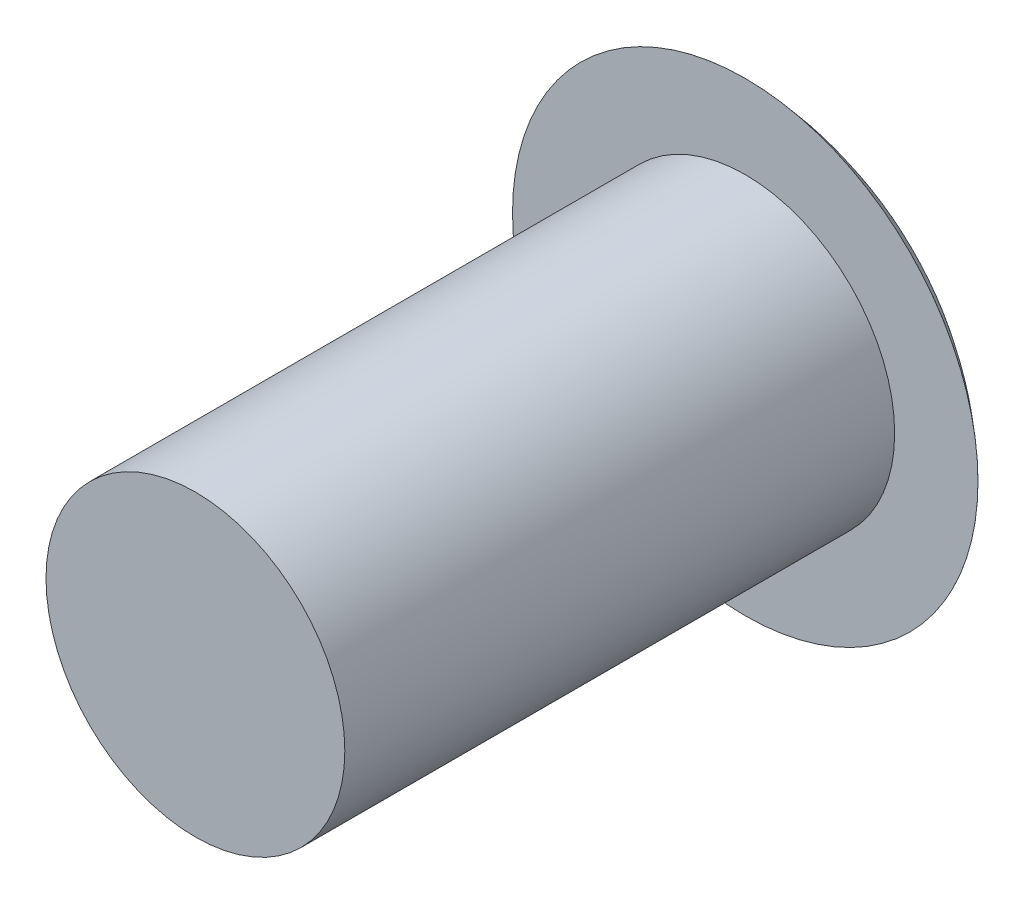
ISO-10303-21;
HEADER;
FILE_DESCRIPTION(('STEP AP214'),'2;1');
FILE_NAME('part.step','',(''),(''),'','','');
FILE_SCHEMA(('AUTOMOTIVE_DESIGN { 1 0 10303 214 1 1 1 1 }'));
ENDSEC;
DATA;
#1=APPLICATION_CONTEXT('core data for automotive mechanical design processes');
#2=APPLICATION_PROTOCOL_DEFINITION('international standard','automotive_design',2000,#1);
#3=PRODUCT_CONTEXT('',#1,'mechanical');
#4=PRODUCT('Part','Part','',(#3));
#5=PRODUCT_RELATED_PRODUCT_CATEGORY('part','',(#4));
#6=PRODUCT_DEFINITION_FORMATION('','',#4);
#7=PRODUCT_DEFINITION_CONTEXT('part definition',#1,'design');
#8=PRODUCT_DEFINITION('design','',#6,#7);
#9=PRODUCT_DEFINITION_SHAPE('','',#8);
#10=(LENGTH_UNIT() NAMED_UNIT(*) SI_UNIT(.MILLI.,.METRE.));
#11=(NAMED_UNIT(*) PLANE_ANGLE_UNIT() SI_UNIT($,.RADIAN.));
#12=(NAMED_UNIT(*) SI_UNIT($,.STERADIAN.) SOLID_ANGLE_UNIT());
#13=UNCERTAINTY_MEASURE_WITH_UNIT(LENGTH_MEASURE(1.E-05),#10,'distance_accuracy_value','');
#14=(GEOMETRIC_REPRESENTATION_CONTEXT(3) GLOBAL_UNCERTAINTY_ASSIGNED_CONTEXT((#13)) GLOBAL_UNIT_ASSIGNED_CONTEXT((#10,
#11,#12)) REPRESENTATION_CONTEXT('',''));
#15=CARTESIAN_POINT('',(0.,0.,0.));
#16=DIRECTION('',(0.,0.,1.));
#17=DIRECTION('',(1.,0.,0.));
#18=AXIS2_PLACEMENT_3D('',#15,#16,#17);
#19=CARTESIAN_POINT('',(0.,0.,29.4163449570512));
#20=DIRECTION('',(0.,0.,-1.));
#21=DIRECTION('',(-1.,0.,0.));
#22=AXIS2_PLACEMENT_3D('',#19,#20,#21);
#23=CYLINDRICAL_SURFACE('',#22,14.49675);
#24=CARTESIAN_POINT('',(0.,0.,29.4163449570512));
#25=DIRECTION('',(0.,0.,1.));
#26=DIRECTION('',(1.,0.,0.));
#27=AXIS2_PLACEMENT_3D('',#24,#25,#26);
#28=CIRCLE('',#27,14.49675);
#29=CARTESIAN_POINT('',(14.49675,0.,29.4163449570512));
#30=VERTEX_POINT('',#29);
#31=EDGE_CURVE('E157',#30,#30,#28,.T.);
#32=ORIENTED_EDGE('',*,*,#31,.F.);
#33=EDGE_LOOP('',(#32));
#34=FACE_BOUND('',#33,.T.);
#35=CARTESIAN_POINT('',(0.,0.,-23.9316950429488));
#36=DIRECTION('',(0.,0.,1.));
#37=DIRECTION('',(1.,0.,0.));
#38=AXIS2_PLACEMENT_3D('',#35,#36,#37);
#39=CIRCLE('',#38,14.49675);
#40=CARTESIAN_POINT('',(14.49675,0.,-23.9316950429488));
#41=VERTEX_POINT('',#40);
#42=EDGE_CURVE('E161',#41,#41,#39,.T.);
#43=ORIENTED_EDGE('',*,*,#42,.T.);
#44=EDGE_LOOP('',(#43));
#45=FACE_BOUND('',#44,.T.);
#46=ADVANCED_FACE('F34',(#34,#45),#23,.T.);
#47=CARTESIAN_POINT('',(0.,0.,29.4163449570512));
#48=DIRECTION('',(0.,0.,1.));
#49=DIRECTION('',(1.,0.,0.));
#50=AXIS2_PLACEMENT_3D('',#47,#48,#49);
#51=PLANE('',#50);
#52=ORIENTED_EDGE('',*,*,#31,.T.);
#53=EDGE_LOOP('',(#52));
#54=FACE_BOUND('',#53,.T.);
#55=ADVANCED_FACE('F279',(#54),#51,.T.);
#56=CARTESIAN_POINT('',(0.,0.,-23.9345943929488));
#57=DIRECTION('',(0.,0.,1.));
#58=DIRECTION('',(1.,0.,0.));
#59=AXIS2_PLACEMENT_3D('',#56,#57,#58);
#60=CYLINDRICAL_SURFACE('',#59,22.580624670715);
#61=CARTESIAN_POINT('',(0.,0.,-23.9345943929488));
#62=DIRECTION('',(0.,0.,-1.));
#63=DIRECTION('',(-1.,0.,0.));
#64=AXIS2_PLACEMENT_3D('',#61,#62,#63);
#65=CIRCLE('',#64,22.580624670715);
#66=CARTESIAN_POINT('',(-22.580624670715,0.,-23.9345943929488));
#67=VERTEX_POINT('',#66);
#68=EDGE_CURVE('E156',#67,#67,#65,.T.);
#69=ORIENTED_EDGE('',*,*,#68,.F.);
#70=EDGE_LOOP('',(#69));
#71=FACE_BOUND('',#70,.T.);
#72=CARTESIAN_POINT('',(0.,0.,-23.9316950429488));
#73=DIRECTION('',(0.,0.,-1.));
#74=DIRECTION('',(-1.,0.,0.));
#75=AXIS2_PLACEMENT_3D('',#72,#73,#74);
#76=CIRCLE('',#75,22.580624670715);
#77=CARTESIAN_POINT('',(-22.580624670715,0.,-23.9316950429488));
#78=VERTEX_POINT('',#77);
#79=EDGE_CURVE('E146',#78,#78,#76,.T.);
#80=ORIENTED_EDGE('',*,*,#79,.T.);
#81=EDGE_LOOP('',(#80));
#82=FACE_BOUND('',#81,.T.);
#83=ADVANCED_FACE('F285',(#71,#82),#60,.T.);
#84=CARTESIAN_POINT('',(0.,0.,1.02666340145344));
#85=DIRECTION('',(0.,0.,1.));
#86=DIRECTION('',(1.,0.,0.));
#87=AXIS2_PLACEMENT_3D('',#84,#85,#86);
#88=SPHERICAL_SURFACE('',#87,33.6593077944022);
#89=CARTESIAN_POINT('',(7.68459701229725,4.43670415366369,1.02666340145344));
#90=DIRECTION('',(-0.866025403784435,-0.500000000000007,0.));
#91=DIRECTION('',(0.500000000000007,-0.866025403784435,0.));
#92=AXIS2_PLACEMENT_3D('',#89,#90,#91);
#93=CIRCLE('',#92,32.468625259006);
#94=CARTESIAN_POINT('',(10.2461293497297,0.,-31.0352428822801));
#95=VERTEX_POINT('',#94);
#96=CARTESIAN_POINT('',(5.12306467486478,8.87340830732732,-31.0352428822801));
#97=VERTEX_POINT('',#96);
#98=EDGE_CURVE('E176',#95,#97,#93,.F.);
#99=ORIENTED_EDGE('',*,*,#98,.T.);
#100=CARTESIAN_POINT('',(0.,8.87340830732727,1.02666340145344));
#101=DIRECTION('',(0.,-1.,0.));
#102=DIRECTION('',(1.,0.,0.));
#103=AXIS2_PLACEMENT_3D('',#100,#101,#102);
#104=CIRCLE('',#103,32.468625259006);
#105=CARTESIAN_POINT('',(-5.12306467486496,8.87340830732722,-31.0352428822801));
#106=VERTEX_POINT('',#105);
#107=EDGE_CURVE('E178',#97,#106,#104,.F.);
#108=ORIENTED_EDGE('',*,*,#107,.T.);
#109=CARTESIAN_POINT('',(-7.68459701229734,4.43670415366362,1.02666340145344));
#110=DIRECTION('',(0.866025403784441,-0.499999999999996,0.));
#111=DIRECTION('',(0.499999999999996,0.866025403784441,0.));
#112=AXIS2_PLACEMENT_3D('',#109,#110,#111);
#113=CIRCLE('',#112,32.468625259006);
#114=CARTESIAN_POINT('',(-10.2461293497297,0.,-31.0352428822801));
#115=VERTEX_POINT('',#114);
#116=EDGE_CURVE('E168',#106,#115,#113,.F.);
#117=ORIENTED_EDGE('',*,*,#116,.T.);
#118=CARTESIAN_POINT('',(-7.68459701229729,-4.43670415366365,1.02666340145344));
#119=DIRECTION('',(0.866025403784438,0.500000000000001,0.));
#120=DIRECTION('',(-0.500000000000001,0.866025403784438,0.));
#121=AXIS2_PLACEMENT_3D('',#118,#119,#120);
#122=CIRCLE('',#121,32.468625259006);
#123=CARTESIAN_POINT('',(-5.12306467486484,-8.87340830732729,-31.0352428822801));
#124=VERTEX_POINT('',#123);
#125=EDGE_CURVE('E170',#115,#124,#122,.F.);
#126=ORIENTED_EDGE('',*,*,#125,.T.);
#127=CARTESIAN_POINT('',(0.,-8.87340830732727,1.02666340145344));
#128=DIRECTION('',(0.,1.,0.));
#129=DIRECTION('',(-1.,0.,0.));
#130=AXIS2_PLACEMENT_3D('',#127,#128,#129);
#131=CIRCLE('',#130,32.468625259006);
#132=CARTESIAN_POINT('',(5.12306467486491,-8.87340830732725,-31.0352428822801));
#133=VERTEX_POINT('',#132);
#134=EDGE_CURVE('E172',#124,#133,#131,.F.);
#135=ORIENTED_EDGE('',*,*,#134,.T.);
#136=CARTESIAN_POINT('',(7.68459701229732,-4.43670415366358,1.02666340145344));
#137=DIRECTION('',(-0.866025403784442,0.499999999999994,0.));
#138=DIRECTION('',(-0.499999999999994,-0.866025403784442,0.));
#139=AXIS2_PLACEMENT_3D('',#136,#137,#138);
#140=CIRCLE('',#139,32.468625259006);
#141=EDGE_CURVE('E174',#133,#95,#140,.F.);
#142=ORIENTED_EDGE('',*,*,#141,.T.);
#143=EDGE_LOOP('',(#99,#108,#117,#126,#135,#142));
#144=FACE_BOUND('',#143,.T.);
#145=ORIENTED_EDGE('',*,*,#68,.T.);
#146=EDGE_LOOP('',(#145));
#147=FACE_BOUND('',#146,.T.);
#148=ADVANCED_FACE('F250',(#144,#147),#88,.T.);
#149=CARTESIAN_POINT('',(0.,0.,-23.9316950429488));
#150=DIRECTION('',(0.,0.,-1.));
#151=DIRECTION('',(-1.,0.,0.));
#152=AXIS2_PLACEMENT_3D('',#149,#150,#151);
#153=PLANE('',#152);
#154=ORIENTED_EDGE('',*,*,#42,.F.);
#155=EDGE_LOOP('',(#154));
#156=FACE_BOUND('',#155,.T.);
#157=ORIENTED_EDGE('',*,*,#79,.F.);
#158=EDGE_LOOP('',(#157));
#159=FACE_BOUND('',#158,.T.);
#160=ADVANCED_FACE('F292',(#156,#159),#153,.F.);
#161=CARTESIAN_POINT('',(-4.80210714679036,8.3174935616303,-142.225175042949));
#162=DIRECTION('',(-0.866025403784442,0.499999999999995,0.));
#163=DIRECTION('',(-0.499999999999995,-0.866025403784442,0.));
#164=AXIS2_PLACEMENT_3D('',#161,#162,#163);
#165=PLANE('',#164);
#166=DIRECTION('',(0.,0.,1.));
#167=VECTOR('',#166,1.);
#168=CARTESIAN_POINT('',(-9.60421429358053,0.,-142.225175042949));
#169=LINE('',#168,#167);
#170=CARTESIAN_POINT('',(-9.60421429358053,0.,-30.7511816297867));
#171=VERTEX_POINT('',#170);
#172=CARTESIAN_POINT('',(-9.60421429358053,0.,-26.2511750429488));
#173=VERTEX_POINT('',#172);
#174=EDGE_CURVE('E109',#171,#173,#169,.T.);
#175=ORIENTED_EDGE('',*,*,#174,.F.);
#176=CARTESIAN_POINT('',(-7.20316072018544,4.15874678081515,1.02666340145344));
#177=DIRECTION('',(-0.866025403784442,0.499999999999995,0.));
#178=DIRECTION('',(-0.499999999999995,-0.866025403784442,0.));
#179=AXIS2_PLACEMENT_3D('',#176,#177,#178);
#180=CIRCLE('',#179,32.1386320162941);
#181=CARTESIAN_POINT('',(-4.80210714679036,8.3174935616303,-30.7511816297867));
#182=VERTEX_POINT('',#181);
#183=EDGE_CURVE('E11',#171,#182,#180,.F.);
#184=ORIENTED_EDGE('',*,*,#183,.T.);
#185=DIRECTION('',(0.,0.,1.));
#186=VECTOR('',#185,1.);
#187=CARTESIAN_POINT('',(-4.80210714679036,8.3174935616303,-142.225175042949));
#188=LINE('',#187,#186);
#189=CARTESIAN_POINT('',(-4.80210714679036,8.3174935616303,-26.2511750429488));
#190=VERTEX_POINT('',#189);
#191=EDGE_CURVE('E132',#182,#190,#188,.T.);
#192=ORIENTED_EDGE('',*,*,#191,.T.);
#193=DIRECTION('',(-0.499999999999995,-0.866025403784441,0.));
#194=VECTOR('',#193,1.);
#195=CARTESIAN_POINT('',(-4.80210714679036,8.3174935616303,-26.2511750429488));
#196=LINE('',#195,#194);
#197=EDGE_CURVE('E124',#190,#173,#196,.T.);
#198=ORIENTED_EDGE('',*,*,#197,.T.);
#199=EDGE_LOOP('',(#175,#184,#192,#198));
#200=FACE_BOUND('',#199,.T.);
#201=ADVANCED_FACE('F130',(#200),#165,.F.);
#202=CARTESIAN_POINT('',(4.80210714679019,8.3174935616304,-142.225175042949));
#203=DIRECTION('',(0.,1.,0.));
#204=DIRECTION('',(-1.,0.,0.));
#205=AXIS2_PLACEMENT_3D('',#202,#203,#204);
#206=PLANE('',#205);
#207=ORIENTED_EDGE('',*,*,#191,.F.);
#208=CARTESIAN_POINT('',(0.,8.31749356163035,1.02666340145344));
#209=DIRECTION('',(0.,1.,0.));
#210=DIRECTION('',(-1.,0.,0.));
#211=AXIS2_PLACEMENT_3D('',#208,#209,#210);
#212=CIRCLE('',#211,32.1386320162942);
#213=CARTESIAN_POINT('',(4.80210714679018,8.3174935616304,-30.7511816297867));
#214=VERTEX_POINT('',#213);
#215=EDGE_CURVE('E160',#182,#214,#212,.F.);
#216=ORIENTED_EDGE('',*,*,#215,.T.);
#217=DIRECTION('',(0.,0.,1.));
#218=VECTOR('',#217,1.);
#219=CARTESIAN_POINT('',(4.80210714679019,8.3174935616304,-142.225175042949));
#220=LINE('',#219,#218);
#221=CARTESIAN_POINT('',(4.80210714679019,8.3174935616304,-26.2511750429488));
#222=VERTEX_POINT('',#221);
#223=EDGE_CURVE('E147',#214,#222,#220,.T.);
#224=ORIENTED_EDGE('',*,*,#223,.T.);
#225=DIRECTION('',(-1.,0.,0.));
#226=VECTOR('',#225,1.);
#227=CARTESIAN_POINT('',(4.80210714679019,8.3174935616304,-26.2511750429488));
#228=LINE('',#227,#226);
#229=EDGE_CURVE('E117',#222,#190,#228,.T.);
#230=ORIENTED_EDGE('',*,*,#229,.T.);
#231=EDGE_LOOP('',(#207,#216,#224,#230));
#232=FACE_BOUND('',#231,.T.);
#233=ADVANCED_FACE('F264',(#232),#206,.F.);
#234=CARTESIAN_POINT('',(9.60421429358053,0.,-142.225175042949));
#235=DIRECTION('',(0.866025403784434,0.500000000000007,0.));
#236=DIRECTION('',(-0.500000000000007,0.866025403784435,0.));
#237=AXIS2_PLACEMENT_3D('',#234,#235,#236);
#238=PLANE('',#237);
#239=ORIENTED_EDGE('',*,*,#223,.F.);
#240=CARTESIAN_POINT('',(7.20316072018536,4.15874678081523,1.02666340145344));
#241=DIRECTION('',(0.866025403784434,0.500000000000007,0.));
#242=DIRECTION('',(-0.500000000000007,0.866025403784435,0.));
#243=AXIS2_PLACEMENT_3D('',#240,#241,#242);
#244=CIRCLE('',#243,32.1386320162942);
#245=CARTESIAN_POINT('',(9.60421429358053,0.,-30.7511816297867));
#246=VERTEX_POINT('',#245);
#247=EDGE_CURVE('E181',#214,#246,#244,.F.);
#248=ORIENTED_EDGE('',*,*,#247,.T.);
#249=DIRECTION('',(0.,0.,1.));
#250=VECTOR('',#249,1.);
#251=CARTESIAN_POINT('',(9.60421429358053,0.,-142.225175042949));
#252=LINE('',#251,#250);
#253=CARTESIAN_POINT('',(9.60421429358053,0.,-26.2511750429488));
#254=VERTEX_POINT('',#253);
#255=EDGE_CURVE('E149',#246,#254,#252,.T.);
#256=ORIENTED_EDGE('',*,*,#255,.T.);
#257=DIRECTION('',(-0.500000000000007,0.866025403784435,0.));
#258=VECTOR('',#257,1.);
#259=CARTESIAN_POINT('',(9.60421429358053,0.,-26.2511750429488));
#260=LINE('',#259,#258);
#261=EDGE_CURVE('E141',#254,#222,#260,.T.);
#262=ORIENTED_EDGE('',*,*,#261,.T.);
#263=EDGE_LOOP('',(#239,#248,#256,#262));
#264=FACE_BOUND('',#263,.T.);
#265=ADVANCED_FACE('F265',(#264),#238,.F.);
#266=CARTESIAN_POINT('',(4.8021071467903,-8.31749356163033,-142.225175042949));
#267=DIRECTION('',(0.866025403784442,-0.499999999999995,0.));
#268=DIRECTION('',(0.499999999999995,0.866025403784442,0.));
#269=AXIS2_PLACEMENT_3D('',#266,#267,#268);
#270=PLANE('',#269);
#271=ORIENTED_EDGE('',*,*,#255,.F.);
#272=CARTESIAN_POINT('',(7.20316072018541,-4.15874678081513,1.02666340145344));
#273=DIRECTION('',(0.866025403784442,-0.499999999999995,0.));
#274=DIRECTION('',(0.499999999999995,0.866025403784442,0.));
#275=AXIS2_PLACEMENT_3D('',#272,#273,#274);
#276=CIRCLE('',#275,32.1386320162941);
#277=CARTESIAN_POINT('',(4.8021071467903,-8.31749356163033,-30.7511816297867));
#278=VERTEX_POINT('',#277);
#279=EDGE_CURVE('E183',#246,#278,#276,.F.);
#280=ORIENTED_EDGE('',*,*,#279,.T.);
#281=DIRECTION('',(0.,0.,1.));
#282=VECTOR('',#281,1.);
#283=CARTESIAN_POINT('',(4.8021071467903,-8.31749356163033,-142.225175042949));
#284=LINE('',#283,#282);
#285=CARTESIAN_POINT('',(4.8021071467903,-8.31749356163033,-26.2511750429488));
#286=VERTEX_POINT('',#285);
#287=EDGE_CURVE('E151',#278,#286,#284,.T.);
#288=ORIENTED_EDGE('',*,*,#287,.T.);
#289=DIRECTION('',(0.499999999999995,0.866025403784442,0.));
#290=VECTOR('',#289,1.);
#291=CARTESIAN_POINT('',(4.8021071467903,-8.31749356163033,-26.2511750429488));
#292=LINE('',#291,#290);
#293=EDGE_CURVE('E138',#286,#254,#292,.T.);
#294=ORIENTED_EDGE('',*,*,#293,.T.);
#295=EDGE_LOOP('',(#271,#280,#288,#294));
#296=FACE_BOUND('',#295,.T.);
#297=ADVANCED_FACE('F268',(#296),#270,.F.);
#298=CARTESIAN_POINT('',(-4.80210714679024,-8.31749356163036,-142.225175042949));
#299=DIRECTION('',(0.,-1.,0.));
#300=DIRECTION('',(1.,0.,0.));
#301=AXIS2_PLACEMENT_3D('',#298,#299,#300);
#302=PLANE('',#301);
#303=ORIENTED_EDGE('',*,*,#287,.F.);
#304=CARTESIAN_POINT('',(0.,-8.31749356163035,1.02666340145344));
#305=DIRECTION('',(0.,-1.,0.));
#306=DIRECTION('',(1.,0.,0.));
#307=AXIS2_PLACEMENT_3D('',#304,#305,#306);
#308=CIRCLE('',#307,32.1386320162942);
#309=CARTESIAN_POINT('',(-4.80210714679025,-8.31749356163037,-30.7511816297867));
#310=VERTEX_POINT('',#309);
#311=EDGE_CURVE('E63',#278,#310,#308,.F.);
#312=ORIENTED_EDGE('',*,*,#311,.T.);
#313=DIRECTION('',(0.,0.,1.));
#314=VECTOR('',#313,1.);
#315=CARTESIAN_POINT('',(-4.80210714679024,-8.31749356163036,-142.225175042949));
#316=LINE('',#315,#314);
#317=CARTESIAN_POINT('',(-4.80210714679024,-8.31749356163036,-26.2511750429488));
#318=VERTEX_POINT('',#317);
#319=EDGE_CURVE('E116',#310,#318,#316,.T.);
#320=ORIENTED_EDGE('',*,*,#319,.T.);
#321=DIRECTION('',(1.,0.,0.));
#322=VECTOR('',#321,1.);
#323=CARTESIAN_POINT('',(-4.80210714679024,-8.31749356163036,-26.2511750429488));
#324=LINE('',#323,#322);
#325=EDGE_CURVE('E128',#318,#286,#324,.T.);
#326=ORIENTED_EDGE('',*,*,#325,.T.);
#327=EDGE_LOOP('',(#303,#312,#320,#326));
#328=FACE_BOUND('',#327,.T.);
#329=ADVANCED_FACE('F269',(#328),#302,.F.);
#330=CARTESIAN_POINT('',(-9.60421429358053,0.,-142.225175042949));
#331=DIRECTION('',(-0.866025403784438,-0.500000000000001,0.));
#332=DIRECTION('',(0.500000000000001,-0.866025403784438,0.));
#333=AXIS2_PLACEMENT_3D('',#330,#331,#332);
#334=PLANE('',#333);
#335=ORIENTED_EDGE('',*,*,#319,.F.);
#336=CARTESIAN_POINT('',(-7.20316072018539,-4.15874678081518,1.02666340145344));
#337=DIRECTION('',(-0.866025403784438,-0.500000000000001,0.));
#338=DIRECTION('',(0.500000000000001,-0.866025403784438,0.));
#339=AXIS2_PLACEMENT_3D('',#336,#337,#338);
#340=CIRCLE('',#339,32.1386320162942);
#341=EDGE_CURVE('E48',#310,#171,#340,.F.);
#342=ORIENTED_EDGE('',*,*,#341,.T.);
#343=ORIENTED_EDGE('',*,*,#174,.T.);
#344=DIRECTION('',(0.500000000000001,-0.866025403784438,0.));
#345=VECTOR('',#344,1.);
#346=CARTESIAN_POINT('',(-9.60421429358053,0.,-26.2511750429488));
#347=LINE('',#346,#345);
#348=EDGE_CURVE('E112',#173,#318,#347,.T.);
#349=ORIENTED_EDGE('',*,*,#348,.T.);
#350=EDGE_LOOP('',(#335,#342,#343,#349));
#351=FACE_BOUND('',#350,.T.);
#352=ADVANCED_FACE('F111',(#351),#334,.F.);
#353=CARTESIAN_POINT('',(0.,0.,-26.2511750429488));
#354=DIRECTION('',(0.,0.,1.));
#355=DIRECTION('',(1.,0.,0.));
#356=AXIS2_PLACEMENT_3D('',#353,#354,#355);
#357=PLANE('',#356);
#358=ORIENTED_EDGE('',*,*,#197,.F.);
#359=ORIENTED_EDGE('',*,*,#229,.F.);
#360=ORIENTED_EDGE('',*,*,#261,.F.);
#361=ORIENTED_EDGE('',*,*,#293,.F.);
#362=ORIENTED_EDGE('',*,*,#325,.F.);
#363=ORIENTED_EDGE('',*,*,#348,.F.);
#364=EDGE_LOOP('',(#358,#359,#360,#361,#362,#363));
#365=FACE_BOUND('',#364,.T.);
#366=ADVANCED_FACE('F122',(#365),#357,.F.);
#367=CARTESIAN_POINT('',(0.,-8.31749356163035,1.02666340145344));
#368=DIRECTION('',(0.,-1.,0.));
#369=DIRECTION('',(1.,0.,0.));
#370=AXIS2_PLACEMENT_3D('',#367,#368,#369);
#371=CONICAL_SURFACE('',#370,32.1386320162942,0.5357033205088);
#372=CARTESIAN_POINT('',(4.8021071467903,-8.31749356163033,-30.7511816297867));
#373=CARTESIAN_POINT('',(4.85556393173188,-8.41008342915841,-30.798688493152));
#374=CARTESIAN_POINT('',(4.90903878495519,-8.50270459186848,-30.846113695946));
#375=CARTESIAN_POINT('',(5.01602462764694,-8.68800950710116,-30.9408007801095));
#376=CARTESIAN_POINT('',(5.06953561711516,-8.7806932596234,-30.98806266148));
#377=CARTESIAN_POINT('',(5.12306467486491,-8.87340830732725,-31.0352428822801));
#378=B_SPLINE_CURVE_WITH_KNOTS('',3,(#372,#373,#374,#375,#376,#377),.UNSPECIFIED.,.F.,.F.,(4,2,
4),(0.,0.350979352842359,0.701958703595851),.UNSPECIFIED.);
#379=EDGE_CURVE('E135',#133,#278,#378,.F.);
#380=ORIENTED_EDGE('',*,*,#379,.F.);
#381=ORIENTED_EDGE('',*,*,#134,.F.);
#382=CARTESIAN_POINT('',(-4.80210714679024,-8.31749356163037,-30.7511816297867));
#383=CARTESIAN_POINT('',(-4.85556393173182,-8.41008342915845,-30.798688493152));
#384=CARTESIAN_POINT('',(-4.90903878495513,-8.50270459186852,-30.846113695946));
#385=CARTESIAN_POINT('',(-5.01602462764688,-8.6880095071012,-30.9408007801095));
#386=CARTESIAN_POINT('',(-5.0695356171151,-8.78069325962344,-30.98806266148));
#387=CARTESIAN_POINT('',(-5.12306467486484,-8.87340830732729,-31.0352428822801));
#388=B_SPLINE_CURVE_WITH_KNOTS('',3,(#382,#383,#384,#385,#386,#387),.UNSPECIFIED.,.F.,.F.,(4,2,
4),(0.,0.350979352842358,0.701958703595845),.UNSPECIFIED.);
#389=EDGE_CURVE('E39',#310,#124,#388,.T.);
#390=ORIENTED_EDGE('',*,*,#389,.F.);
#391=ORIENTED_EDGE('',*,*,#311,.F.);
#392=EDGE_LOOP('',(#380,#381,#390,#391));
#393=FACE_BOUND('',#392,.T.);
#394=ADVANCED_FACE('F36',(#393),#371,.T.);
#395=CARTESIAN_POINT('',(-7.20316072018539,-4.15874678081518,1.02666340145344));
#396=DIRECTION('',(-0.866025403784438,-0.500000000000001,0.));
#397=DIRECTION('',(0.500000000000001,-0.866025403784438,0.));
#398=AXIS2_PLACEMENT_3D('',#395,#396,#397);
#399=CONICAL_SURFACE('',#398,32.1386320162942,0.5357033205088);
#400=ORIENTED_EDGE('',*,*,#389,.T.);
#401=ORIENTED_EDGE('',*,*,#125,.F.);
#402=CARTESIAN_POINT('',(-9.60421429358053,0.,-30.7511816297867));
#403=CARTESIAN_POINT('',(-9.71112786346367,0.,-30.798688493152));
#404=CARTESIAN_POINT('',(-9.8180775699103,0.,-30.846113695946));
#405=CARTESIAN_POINT('',(-10.0320492552938,0.,-30.9408007801095));
#406=CARTESIAN_POINT('',(-10.1390712342302,0.,-30.98806266148));
#407=CARTESIAN_POINT('',(-10.2461293497297,0.,-31.0352428822801));
#408=B_SPLINE_CURVE_WITH_KNOTS('',3,(#402,#403,#404,#405,#406,#407),.UNSPECIFIED.,.F.,.F.,(4,2,
4),(0.,0.35097935284236,0.701958703595848),.UNSPECIFIED.);
#409=EDGE_CURVE('E220',#171,#115,#408,.T.);
#410=ORIENTED_EDGE('',*,*,#409,.F.);
#411=ORIENTED_EDGE('',*,*,#341,.F.);
#412=EDGE_LOOP('',(#400,#401,#410,#411));
#413=FACE_BOUND('',#412,.T.);
#414=ADVANCED_FACE('F228',(#413),#399,.T.);
#415=CARTESIAN_POINT('',(7.20316072018541,-4.15874678081513,1.02666340145344));
#416=DIRECTION('',(0.866025403784442,-0.499999999999994,0.));
#417=DIRECTION('',(0.499999999999994,0.866025403784442,0.));
#418=AXIS2_PLACEMENT_3D('',#415,#416,#417);
#419=CONICAL_SURFACE('',#418,32.1386320162942,0.535703320508801);
#420=ORIENTED_EDGE('',*,*,#379,.T.);
#421=ORIENTED_EDGE('',*,*,#279,.F.);
#422=CARTESIAN_POINT('',(9.60421429358053,0.,-30.7511816297867));
#423=CARTESIAN_POINT('',(9.71112786346367,0.,-30.798688493152));
#424=CARTESIAN_POINT('',(9.81807756991029,0.,-30.846113695946));
#425=CARTESIAN_POINT('',(10.0320492552938,0.,-30.9408007801095));
#426=CARTESIAN_POINT('',(10.1390712342302,0.,-30.98806266148));
#427=CARTESIAN_POINT('',(10.2461293497297,0.,-31.0352428822801));
#428=B_SPLINE_CURVE_WITH_KNOTS('',3,(#422,#423,#424,#425,#426,#427),.UNSPECIFIED.,.F.,.F.,(4,2,
4),(0.,0.350979352842355,0.701958703595843),.UNSPECIFIED.);
#429=EDGE_CURVE('E213',#95,#246,#428,.F.);
#430=ORIENTED_EDGE('',*,*,#429,.F.);
#431=ORIENTED_EDGE('',*,*,#141,.F.);
#432=EDGE_LOOP('',(#420,#421,#430,#431));
#433=FACE_BOUND('',#432,.T.);
#434=ADVANCED_FACE('F225',(#433),#419,.T.);
#435=CARTESIAN_POINT('',(-7.20316072018544,4.15874678081515,1.02666340145344));
#436=DIRECTION('',(-0.866025403784441,0.499999999999996,0.));
#437=DIRECTION('',(-0.499999999999996,-0.866025403784441,0.));
#438=AXIS2_PLACEMENT_3D('',#435,#436,#437);
#439=CONICAL_SURFACE('',#438,32.1386320162941,0.535703320508801);
#440=ORIENTED_EDGE('',*,*,#409,.T.);
#441=ORIENTED_EDGE('',*,*,#116,.F.);
#442=CARTESIAN_POINT('',(-5.12306467486496,8.87340830732722,-31.0352428822801));
#443=CARTESIAN_POINT('',(-5.06953561711521,8.78069325962337,-30.98806266148));
#444=CARTESIAN_POINT('',(-5.01602462764699,8.68800950710113,-30.9408007801095));
#445=CARTESIAN_POINT('',(-4.90903878495524,8.50270459186845,-30.846113695946));
#446=CARTESIAN_POINT('',(-4.85556393173193,8.41008342915838,-30.798688493152));
#447=CARTESIAN_POINT('',(-4.80210714679036,8.3174935616303,-30.7511816297867));
#448=B_SPLINE_CURVE_WITH_KNOTS('',3,(#442,#443,#444,#445,#446,#447),.UNSPECIFIED.,.F.,.F.,(4,2,
4),(0.,0.350979350753486,0.701958703595842),.UNSPECIFIED.);
#449=EDGE_CURVE('E195',#182,#106,#448,.F.);
#450=ORIENTED_EDGE('',*,*,#449,.F.);
#451=ORIENTED_EDGE('',*,*,#183,.F.);
#452=EDGE_LOOP('',(#440,#441,#450,#451));
#453=FACE_BOUND('',#452,.T.);
#454=ADVANCED_FACE('F208',(#453),#439,.T.);
#455=CARTESIAN_POINT('',(7.20316072018535,4.15874678081523,1.02666340145344));
#456=DIRECTION('',(0.866025403784435,0.500000000000007,0.));
#457=DIRECTION('',(-0.500000000000007,0.866025403784435,0.));
#458=AXIS2_PLACEMENT_3D('',#455,#456,#457);
#459=CONICAL_SURFACE('',#458,32.1386320162942,0.535703320508801);
#460=ORIENTED_EDGE('',*,*,#429,.T.);
#461=ORIENTED_EDGE('',*,*,#247,.F.);
#462=CARTESIAN_POINT('',(4.80210714679018,8.3174935616304,-30.7511816297867));
#463=CARTESIAN_POINT('',(4.85556393173176,8.41008342915848,-30.798688493152));
#464=CARTESIAN_POINT('',(4.90903878495507,8.50270459186855,-30.846113695946));
#465=CARTESIAN_POINT('',(5.01602462764682,8.68800950710123,-30.9408007801095));
#466=CARTESIAN_POINT('',(5.06953561711504,8.78069325962347,-30.98806266148));
#467=CARTESIAN_POINT('',(5.12306467486478,8.87340830732732,-31.0352428822801));
#468=B_SPLINE_CURVE_WITH_KNOTS('',3,(#462,#463,#464,#465,#466,#467),.UNSPECIFIED.,.F.,.F.,(4,2,
4),(0.,0.350979352842357,0.701958703595847),.UNSPECIFIED.);
#469=EDGE_CURVE('E187',#97,#214,#468,.F.);
#470=ORIENTED_EDGE('',*,*,#469,.F.);
#471=ORIENTED_EDGE('',*,*,#98,.F.);
#472=EDGE_LOOP('',(#460,#461,#470,#471));
#473=FACE_BOUND('',#472,.T.);
#474=ADVANCED_FACE('F205',(#473),#459,.T.);
#475=CARTESIAN_POINT('',(0.,8.31749356163035,1.02666340145344));
#476=DIRECTION('',(0.,1.,0.));
#477=DIRECTION('',(-1.,0.,0.));
#478=AXIS2_PLACEMENT_3D('',#475,#476,#477);
#479=CONICAL_SURFACE('',#478,32.1386320162942,0.5357033205088);
#480=ORIENTED_EDGE('',*,*,#449,.T.);
#481=ORIENTED_EDGE('',*,*,#107,.F.);
#482=ORIENTED_EDGE('',*,*,#469,.T.);
#483=ORIENTED_EDGE('',*,*,#215,.F.);
#484=EDGE_LOOP('',(#480,#481,#482,#483));
#485=FACE_BOUND('',#484,.T.);
#486=ADVANCED_FACE('F202',(#485),#479,.T.);
#487=CLOSED_SHELL('',(#46,#55,#83,#148,#160,#201,#233,#265,#297,#329,#352,#366,#394,#414,#434,
#454,#474,#486));
#488=MANIFOLD_SOLID_BREP('B2',#487);
#489=ADVANCED_BREP_SHAPE_REPRESENTATION('',(#18,#488),#14);
#490=SHAPE_DEFINITION_REPRESENTATION(#9,#489);
ENDSEC;
END-ISO-10303-21;
